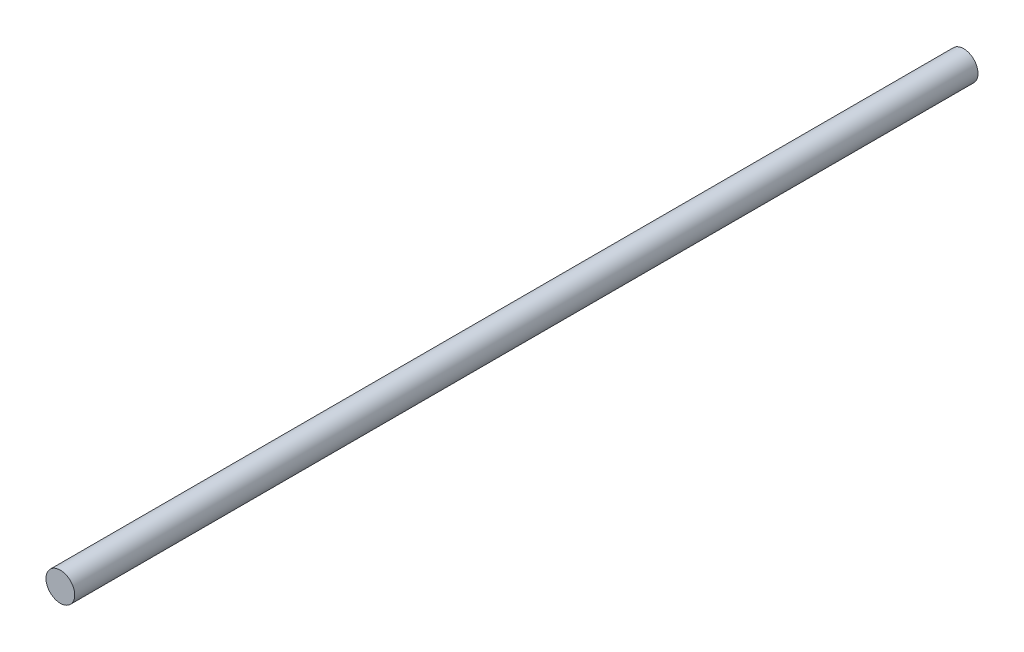
ISO-10303-21;
HEADER;
FILE_DESCRIPTION(('STEP AP214'),'2;1');
FILE_NAME('part.step','',(''),(''),'','','');
FILE_SCHEMA(('AUTOMOTIVE_DESIGN { 1 0 10303 214 1 1 1 1 }'));
ENDSEC;
DATA;
#1=APPLICATION_CONTEXT('core data for automotive mechanical design processes');
#2=APPLICATION_PROTOCOL_DEFINITION('international standard','automotive_design',2000,#1);
#3=PRODUCT_CONTEXT('',#1,'mechanical');
#4=PRODUCT('Part','Part','',(#3));
#5=PRODUCT_RELATED_PRODUCT_CATEGORY('part','',(#4));
#6=PRODUCT_DEFINITION_FORMATION('','',#4);
#7=PRODUCT_DEFINITION_CONTEXT('part definition',#1,'design');
#8=PRODUCT_DEFINITION('design','',#6,#7);
#9=PRODUCT_DEFINITION_SHAPE('','',#8);
#10=(LENGTH_UNIT() NAMED_UNIT(*) SI_UNIT(.MILLI.,.METRE.));
#11=(NAMED_UNIT(*) PLANE_ANGLE_UNIT() SI_UNIT($,.RADIAN.));
#12=(NAMED_UNIT(*) SI_UNIT($,.STERADIAN.) SOLID_ANGLE_UNIT());
#13=UNCERTAINTY_MEASURE_WITH_UNIT(LENGTH_MEASURE(1.E-05),#10,'distance_accuracy_value','');
#14=(GEOMETRIC_REPRESENTATION_CONTEXT(3) GLOBAL_UNCERTAINTY_ASSIGNED_CONTEXT((#13)) GLOBAL_UNIT_ASSIGNED_CONTEXT((#10,
#11,#12)) REPRESENTATION_CONTEXT('',''));
#15=CARTESIAN_POINT('',(0.,0.,0.));
#16=DIRECTION('',(0.,0.,1.));
#17=DIRECTION('',(1.,0.,0.));
#18=AXIS2_PLACEMENT_3D('',#15,#16,#17);
#19=CARTESIAN_POINT('',(0.,0.,-199.644));
#20=DIRECTION('',(0.,0.,1.));
#21=DIRECTION('',(1.,0.,0.));
#22=AXIS2_PLACEMENT_3D('',#19,#20,#21);
#23=CYLINDRICAL_SURFACE('',#22,3.175);
#24=CARTESIAN_POINT('',(0.,0.,-199.644));
#25=DIRECTION('',(0.,0.,1.));
#26=DIRECTION('',(1.,0.,0.));
#27=AXIS2_PLACEMENT_3D('',#24,#25,#26);
#28=CIRCLE('',#27,3.175);
#29=CARTESIAN_POINT('',(3.175,0.,-199.644));
#30=VERTEX_POINT('',#29);
#31=EDGE_CURVE('E10',#30,#30,#28,.T.);
#32=CARTESIAN_POINT('',(0.,0.,0.));
#33=DIRECTION('',(0.,0.,1.));
#34=DIRECTION('',(1.,0.,0.));
#35=AXIS2_PLACEMENT_3D('',#32,#33,#34);
#36=CIRCLE('',#35,3.175);
#37=CARTESIAN_POINT('',(3.175,0.,0.));
#38=VERTEX_POINT('',#37);
#39=EDGE_CURVE('E46',#38,#38,#36,.T.);
#40=CARTESIAN_POINT('',(3.175,0.,-199.644));
#41=CARTESIAN_POINT('',(3.175,0.,-197.564375));
#42=CARTESIAN_POINT('',(3.175,0.,-195.48475));
#43=CARTESIAN_POINT('',(3.175,0.,-191.3255));
#44=CARTESIAN_POINT('',(3.175,0.,-189.245875));
#45=CARTESIAN_POINT('',(3.175,0.,-185.086625));
#46=CARTESIAN_POINT('',(3.175,0.,-183.007));
#47=CARTESIAN_POINT('',(3.175,0.,-178.84775));
#48=CARTESIAN_POINT('',(3.175,0.,-176.768125));
#49=CARTESIAN_POINT('',(3.175,0.,-172.608875));
#50=CARTESIAN_POINT('',(3.175,0.,-170.52925));
#51=CARTESIAN_POINT('',(3.175,0.,-166.37));
#52=CARTESIAN_POINT('',(3.175,0.,-164.290375));
#53=CARTESIAN_POINT('',(3.175,0.,-160.131125));
#54=CARTESIAN_POINT('',(3.175,0.,-158.0515));
#55=CARTESIAN_POINT('',(3.175,0.,-153.89225));
#56=CARTESIAN_POINT('',(3.175,0.,-151.812625));
#57=CARTESIAN_POINT('',(3.175,0.,-147.653375));
#58=CARTESIAN_POINT('',(3.175,0.,-145.57375));
#59=CARTESIAN_POINT('',(3.175,0.,-141.4145));
#60=CARTESIAN_POINT('',(3.175,0.,-139.334875));
#61=CARTESIAN_POINT('',(3.175,0.,-135.175625));
#62=CARTESIAN_POINT('',(3.175,0.,-133.096));
#63=CARTESIAN_POINT('',(3.175,0.,-128.93675));
#64=CARTESIAN_POINT('',(3.175,0.,-126.857125));
#65=CARTESIAN_POINT('',(3.175,0.,-122.697875));
#66=CARTESIAN_POINT('',(3.175,0.,-120.61825));
#67=CARTESIAN_POINT('',(3.175,0.,-116.459));
#68=CARTESIAN_POINT('',(3.175,0.,-114.379375));
#69=CARTESIAN_POINT('',(3.175,0.,-110.220125));
#70=CARTESIAN_POINT('',(3.175,0.,-108.1405));
#71=CARTESIAN_POINT('',(3.175,0.,-103.98125));
#72=CARTESIAN_POINT('',(3.175,0.,-101.901625));
#73=CARTESIAN_POINT('',(3.175,0.,-97.742375));
#74=CARTESIAN_POINT('',(3.175,0.,-95.66275));
#75=CARTESIAN_POINT('',(3.175,0.,-91.5035));
#76=CARTESIAN_POINT('',(3.175,0.,-89.423875));
#77=CARTESIAN_POINT('',(3.175,0.,-85.264625));
#78=CARTESIAN_POINT('',(3.175,0.,-83.185));
#79=CARTESIAN_POINT('',(3.175,0.,-79.02575));
#80=CARTESIAN_POINT('',(3.175,0.,-76.946125));
#81=CARTESIAN_POINT('',(3.175,0.,-72.786875));
#82=CARTESIAN_POINT('',(3.175,0.,-70.70725));
#83=CARTESIAN_POINT('',(3.175,0.,-66.548));
#84=CARTESIAN_POINT('',(3.175,0.,-64.468375));
#85=CARTESIAN_POINT('',(3.175,0.,-60.309125));
#86=CARTESIAN_POINT('',(3.175,0.,-58.2295));
#87=CARTESIAN_POINT('',(3.175,0.,-54.07025));
#88=CARTESIAN_POINT('',(3.175,0.,-51.990625));
#89=CARTESIAN_POINT('',(3.175,0.,-47.831375));
#90=CARTESIAN_POINT('',(3.175,0.,-45.75175));
#91=CARTESIAN_POINT('',(3.175,0.,-41.5925));
#92=CARTESIAN_POINT('',(3.175,0.,-39.512875));
#93=CARTESIAN_POINT('',(3.175,0.,-35.353625));
#94=CARTESIAN_POINT('',(3.175,0.,-33.274));
#95=CARTESIAN_POINT('',(3.175,0.,-29.11475));
#96=CARTESIAN_POINT('',(3.175,0.,-27.035125));
#97=CARTESIAN_POINT('',(3.175,0.,-22.875875));
#98=CARTESIAN_POINT('',(3.175,0.,-20.79625));
#99=CARTESIAN_POINT('',(3.175,0.,-16.637));
#100=CARTESIAN_POINT('',(3.175,0.,-14.557375));
#101=CARTESIAN_POINT('',(3.175,0.,-10.398125));
#102=CARTESIAN_POINT('',(3.175,0.,-8.31850000000001));
#103=CARTESIAN_POINT('',(3.175,0.,-4.15925));
#104=CARTESIAN_POINT('',(3.175,0.,-2.079625));
#105=CARTESIAN_POINT('',(3.175,0.,0.));
#106=B_SPLINE_CURVE_WITH_KNOTS('',3,(#40,#41,#42,#43,#44,#45,#46,#47,#48,#49,#50,#51,#52,#53,
#54,#55,#56,#57,#58,#59,#60,#61,#62,#63,#64,#65,#66,#67,#68,#69,#70,#71,#72,#73,#74,#75,#76,#77,
#78,#79,#80,#81,#82,#83,#84,#85,#86,#87,#88,#89,#90,#91,#92,#93,#94,#95,#96,#97,#98,#99,#100,
#101,#102,#103,#104,#105),.UNSPECIFIED.,.F.,.F.,(4,2,2,2,2,2,2,2,2,2,2,2,2,2,2,2,2,2,2,2,2,2,2,
2,2,2,2,2,2,2,2,2,4),(0.,6.23887499999998,12.47775,18.716625,24.9555,31.194375,37.43325,
43.672125,49.911,56.149875,62.38875,68.627625,74.8665,81.105375,87.34425,93.583125,99.822,
106.060875,112.29975,118.538625,124.7775,131.016375,137.25525,143.494125,149.733,155.971875,
162.21075,168.449625,174.6885,180.927375,187.16625,193.405125,199.644),.UNSPECIFIED.);
#107=EDGE_CURVE('BSEAM43',#30,#38,#106,.T.);
#108=ORIENTED_EDGE('',*,*,#31,.T.);
#109=ORIENTED_EDGE('',*,*,#39,.F.);
#110=ORIENTED_EDGE('',*,*,#107,.T.);
#111=ORIENTED_EDGE('',*,*,#107,.F.);
#112=EDGE_LOOP('',(#108,#110,#109,#111));
#113=FACE_BOUND('',#112,.T.);
#114=ADVANCED_FACE('F43',(#113),#23,.T.);
#115=CARTESIAN_POINT('',(0.,0.,-199.644));
#116=DIRECTION('',(0.,0.,1.));
#117=DIRECTION('',(1.,0.,0.));
#118=AXIS2_PLACEMENT_3D('',#115,#116,#117);
#119=PLANE('',#118);
#120=ORIENTED_EDGE('',*,*,#31,.F.);
#121=EDGE_LOOP('',(#120));
#122=FACE_BOUND('',#121,.T.);
#123=ADVANCED_FACE('F60',(#122),#119,.F.);
#124=CARTESIAN_POINT('',(0.,0.,0.));
#125=DIRECTION('',(0.,0.,1.));
#126=DIRECTION('',(1.,0.,0.));
#127=AXIS2_PLACEMENT_3D('',#124,#125,#126);
#128=PLANE('',#127);
#129=ORIENTED_EDGE('',*,*,#39,.T.);
#130=EDGE_LOOP('',(#129));
#131=FACE_BOUND('',#130,.T.);
#132=ADVANCED_FACE('F57',(#131),#128,.T.);
#133=CLOSED_SHELL('',(#114,#123,#132));
#134=MANIFOLD_SOLID_BREP('B2',#133);
#135=ADVANCED_BREP_SHAPE_REPRESENTATION('',(#18,#134),#14);
#136=SHAPE_DEFINITION_REPRESENTATION(#9,#135);
ENDSEC;
END-ISO-10303-21;
